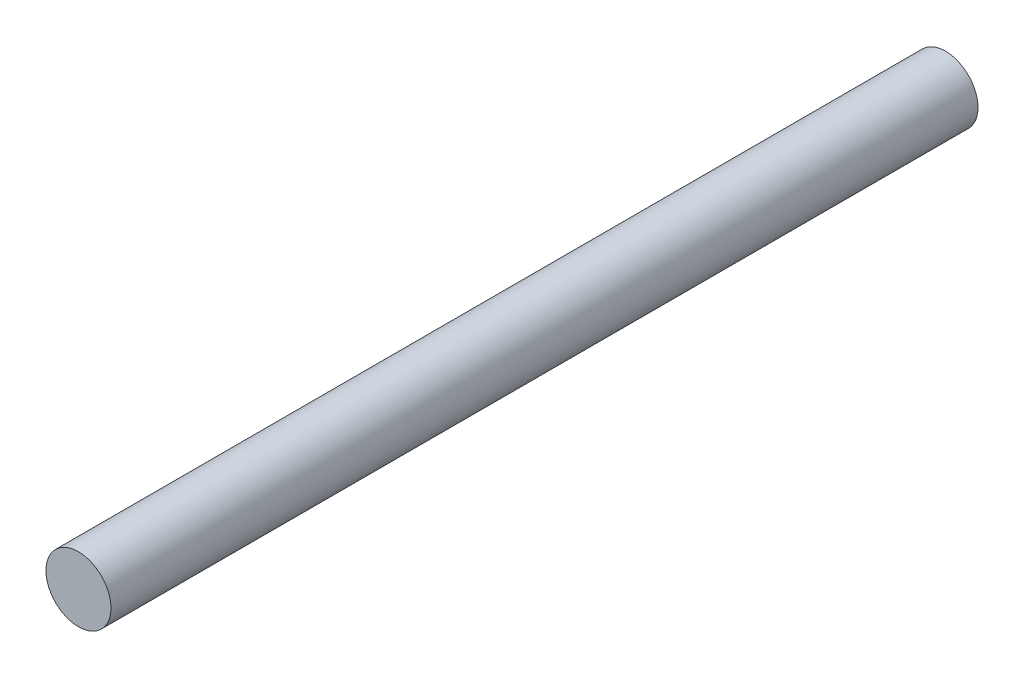
ISO-10303-21;
HEADER;
FILE_DESCRIPTION(('STEP AP214'),'2;1');
FILE_NAME('part.step','',(''),(''),'','','');
FILE_SCHEMA(('AUTOMOTIVE_DESIGN { 1 0 10303 214 1 1 1 1 }'));
ENDSEC;
DATA;
#1=APPLICATION_CONTEXT('core data for automotive mechanical design processes');
#2=APPLICATION_PROTOCOL_DEFINITION('international standard','automotive_design',2000,#1);
#3=PRODUCT_CONTEXT('',#1,'mechanical');
#4=PRODUCT('Part','Part','',(#3));
#5=PRODUCT_RELATED_PRODUCT_CATEGORY('part','',(#4));
#6=PRODUCT_DEFINITION_FORMATION('','',#4);
#7=PRODUCT_DEFINITION_CONTEXT('part definition',#1,'design');
#8=PRODUCT_DEFINITION('design','',#6,#7);
#9=PRODUCT_DEFINITION_SHAPE('','',#8);
#10=(LENGTH_UNIT() NAMED_UNIT(*) SI_UNIT(.MILLI.,.METRE.));
#11=(NAMED_UNIT(*) PLANE_ANGLE_UNIT() SI_UNIT($,.RADIAN.));
#12=(NAMED_UNIT(*) SI_UNIT($,.STERADIAN.) SOLID_ANGLE_UNIT());
#13=UNCERTAINTY_MEASURE_WITH_UNIT(LENGTH_MEASURE(1.E-05),#10,'distance_accuracy_value','');
#14=(GEOMETRIC_REPRESENTATION_CONTEXT(3) GLOBAL_UNCERTAINTY_ASSIGNED_CONTEXT((#13)) GLOBAL_UNIT_ASSIGNED_CONTEXT((#10,
#11,#12)) REPRESENTATION_CONTEXT('',''));
#15=CARTESIAN_POINT('',(0.,0.,0.));
#16=DIRECTION('',(0.,0.,1.));
#17=DIRECTION('',(1.,0.,0.));
#18=AXIS2_PLACEMENT_3D('',#15,#16,#17);
#19=CARTESIAN_POINT('',(0.,0.,200.));
#20=DIRECTION('',(0.,0.,-1.));
#21=DIRECTION('',(-1.,0.,0.));
#22=AXIS2_PLACEMENT_3D('',#19,#20,#21);
#23=CYLINDRICAL_SURFACE('',#22,7.5);
#24=CARTESIAN_POINT('',(0.,0.,200.));
#25=DIRECTION('',(0.,0.,1.));
#26=DIRECTION('',(1.,0.,0.));
#27=AXIS2_PLACEMENT_3D('',#24,#25,#26);
#28=CIRCLE('',#27,7.5);
#29=CARTESIAN_POINT('',(7.5,0.,200.));
#30=VERTEX_POINT('',#29);
#31=EDGE_CURVE('E10',#30,#30,#28,.T.);
#32=ORIENTED_EDGE('',*,*,#31,.F.);
#33=EDGE_LOOP('',(#32));
#34=FACE_BOUND('',#33,.T.);
#35=CARTESIAN_POINT('',(0.,0.,0.));
#36=DIRECTION('',(0.,0.,1.));
#37=DIRECTION('',(1.,0.,0.));
#38=AXIS2_PLACEMENT_3D('',#35,#36,#37);
#39=CIRCLE('',#38,7.5);
#40=CARTESIAN_POINT('',(7.5,0.,0.));
#41=VERTEX_POINT('',#40);
#42=EDGE_CURVE('E36',#41,#41,#39,.T.);
#43=ORIENTED_EDGE('',*,*,#42,.T.);
#44=EDGE_LOOP('',(#43));
#45=FACE_BOUND('',#44,.T.);
#46=ADVANCED_FACE('F33',(#34,#45),#23,.T.);
#47=CARTESIAN_POINT('',(0.,0.,200.));
#48=DIRECTION('',(0.,0.,1.));
#49=DIRECTION('',(1.,0.,0.));
#50=AXIS2_PLACEMENT_3D('',#47,#48,#49);
#51=PLANE('',#50);
#52=ORIENTED_EDGE('',*,*,#31,.T.);
#53=EDGE_LOOP('',(#52));
#54=FACE_BOUND('',#53,.T.);
#55=ADVANCED_FACE('F48',(#54),#51,.T.);
#56=CARTESIAN_POINT('',(0.,0.,0.));
#57=DIRECTION('',(0.,0.,1.));
#58=DIRECTION('',(1.,0.,0.));
#59=AXIS2_PLACEMENT_3D('',#56,#57,#58);
#60=PLANE('',#59);
#61=ORIENTED_EDGE('',*,*,#42,.F.);
#62=EDGE_LOOP('',(#61));
#63=FACE_BOUND('',#62,.T.);
#64=ADVANCED_FACE('F46',(#63),#60,.F.);
#65=CLOSED_SHELL('',(#46,#55,#64));
#66=MANIFOLD_SOLID_BREP('B2',#65);
#67=ADVANCED_BREP_SHAPE_REPRESENTATION('',(#18,#66),#14);
#68=SHAPE_DEFINITION_REPRESENTATION(#9,#67);
ENDSEC;
END-ISO-10303-21;
